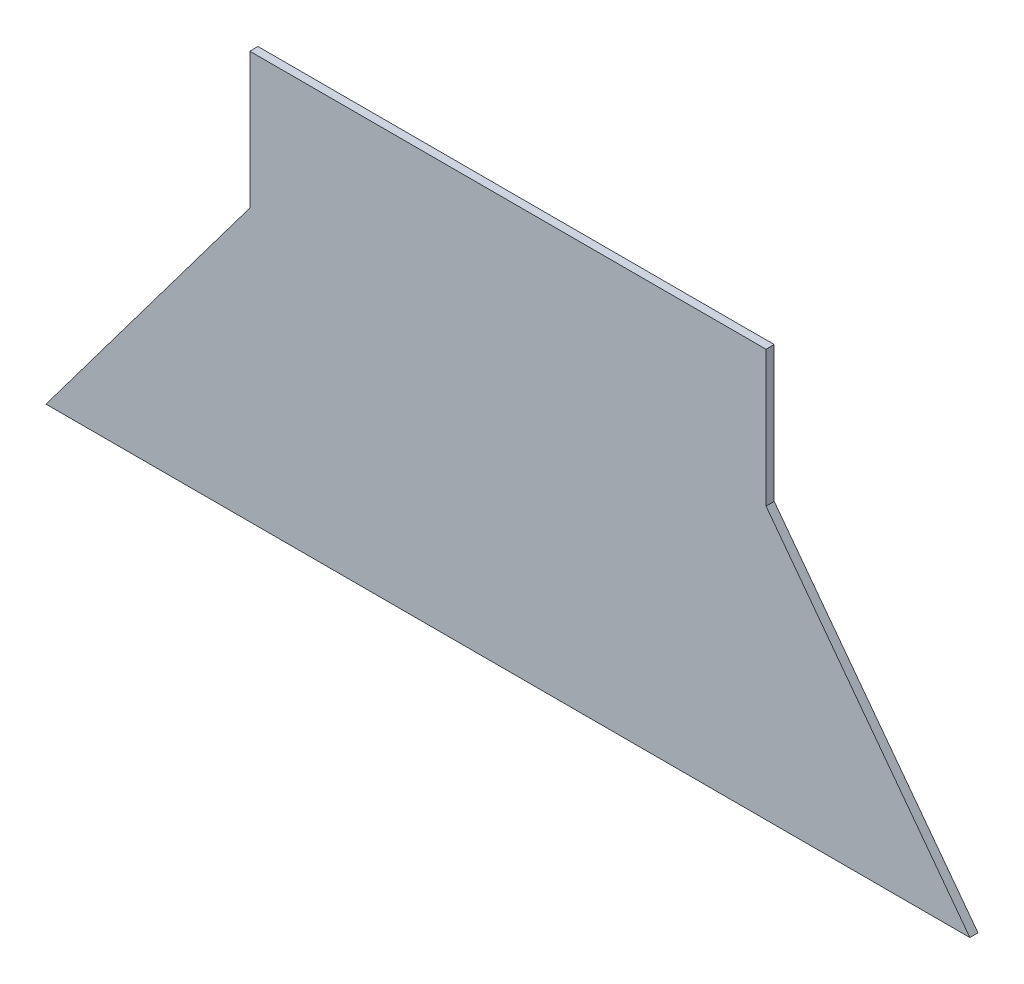
ISO-10303-21;
HEADER;
FILE_DESCRIPTION(('STEP AP214'),'2;1');
FILE_NAME('part.step','',(''),(''),'','','');
FILE_SCHEMA(('AUTOMOTIVE_DESIGN { 1 0 10303 214 1 1 1 1 }'));
ENDSEC;
DATA;
#1=APPLICATION_CONTEXT('core data for automotive mechanical design processes');
#2=APPLICATION_PROTOCOL_DEFINITION('international standard','automotive_design',2000,#1);
#3=PRODUCT_CONTEXT('',#1,'mechanical');
#4=PRODUCT('Part','Part','',(#3));
#5=PRODUCT_RELATED_PRODUCT_CATEGORY('part','',(#4));
#6=PRODUCT_DEFINITION_FORMATION('','',#4);
#7=PRODUCT_DEFINITION_CONTEXT('part definition',#1,'design');
#8=PRODUCT_DEFINITION('design','',#6,#7);
#9=PRODUCT_DEFINITION_SHAPE('','',#8);
#10=(LENGTH_UNIT() NAMED_UNIT(*) SI_UNIT(.MILLI.,.METRE.));
#11=(NAMED_UNIT(*) PLANE_ANGLE_UNIT() SI_UNIT($,.RADIAN.));
#12=(NAMED_UNIT(*) SI_UNIT($,.STERADIAN.) SOLID_ANGLE_UNIT());
#13=UNCERTAINTY_MEASURE_WITH_UNIT(LENGTH_MEASURE(1.E-05),#10,'distance_accuracy_value','');
#14=(GEOMETRIC_REPRESENTATION_CONTEXT(3) GLOBAL_UNCERTAINTY_ASSIGNED_CONTEXT((#13)) GLOBAL_UNIT_ASSIGNED_CONTEXT((#10,
#11,#12)) REPRESENTATION_CONTEXT('',''));
#15=CARTESIAN_POINT('',(0.,0.,0.));
#16=DIRECTION('',(0.,0.,1.));
#17=DIRECTION('',(1.,0.,0.));
#18=AXIS2_PLACEMENT_3D('',#15,#16,#17);
#19=CARTESIAN_POINT('',(680.,0.,6.));
#20=DIRECTION('',(0.,1.,0.));
#21=DIRECTION('',(0.,0.,1.));
#22=AXIS2_PLACEMENT_3D('',#19,#20,#21);
#23=PLANE('',#22);
#24=DIRECTION('',(1.,0.,0.));
#25=VECTOR('',#24,1.);
#26=CARTESIAN_POINT('',(680.,0.,0.));
#27=LINE('',#26,#25);
#28=CARTESIAN_POINT('',(0.,0.,0.));
#29=VERTEX_POINT('',#28);
#30=CARTESIAN_POINT('',(680.,0.,0.));
#31=VERTEX_POINT('',#30);
#32=EDGE_CURVE('E132',#29,#31,#27,.T.);
#33=ORIENTED_EDGE('',*,*,#32,.T.);
#34=DIRECTION('',(0.,0.,-1.));
#35=VECTOR('',#34,1.);
#36=CARTESIAN_POINT('',(680.,0.,6.));
#37=LINE('',#36,#35);
#38=CARTESIAN_POINT('',(680.,0.,6.));
#39=VERTEX_POINT('',#38);
#40=EDGE_CURVE('E11',#39,#31,#37,.T.);
#41=ORIENTED_EDGE('',*,*,#40,.F.);
#42=DIRECTION('',(1.,0.,0.));
#43=VECTOR('',#42,1.);
#44=CARTESIAN_POINT('',(680.,0.,6.));
#45=LINE('',#44,#43);
#46=CARTESIAN_POINT('',(0.,0.,6.));
#47=VERTEX_POINT('',#46);
#48=EDGE_CURVE('E148',#47,#39,#45,.T.);
#49=ORIENTED_EDGE('',*,*,#48,.F.);
#50=DIRECTION('',(0.,0.,-1.));
#51=VECTOR('',#50,1.);
#52=CARTESIAN_POINT('',(0.,0.,6.));
#53=LINE('',#52,#51);
#54=EDGE_CURVE('E128',#47,#29,#53,.T.);
#55=ORIENTED_EDGE('',*,*,#54,.T.);
#56=EDGE_LOOP('',(#33,#41,#49,#55));
#57=FACE_BOUND('',#56,.T.);
#58=ADVANCED_FACE('F43',(#57),#23,.F.);
#59=CARTESIAN_POINT('',(530.,200.,6.));
#60=DIRECTION('',(-0.8,-0.6,0.));
#61=DIRECTION('',(0.6,-0.8,0.));
#62=AXIS2_PLACEMENT_3D('',#59,#60,#61);
#63=PLANE('',#62);
#64=DIRECTION('',(-0.6,0.8,0.));
#65=VECTOR('',#64,1.);
#66=CARTESIAN_POINT('',(530.,200.,0.));
#67=LINE('',#66,#65);
#68=CARTESIAN_POINT('',(530.,200.,0.));
#69=VERTEX_POINT('',#68);
#70=EDGE_CURVE('E136',#31,#69,#67,.T.);
#71=ORIENTED_EDGE('',*,*,#70,.T.);
#72=DIRECTION('',(0.,0.,-1.));
#73=VECTOR('',#72,1.);
#74=CARTESIAN_POINT('',(530.,200.,6.));
#75=LINE('',#74,#73);
#76=CARTESIAN_POINT('',(530.,200.,6.));
#77=VERTEX_POINT('',#76);
#78=EDGE_CURVE('E52',#77,#69,#75,.T.);
#79=ORIENTED_EDGE('',*,*,#78,.F.);
#80=DIRECTION('',(-0.6,0.8,0.));
#81=VECTOR('',#80,1.);
#82=CARTESIAN_POINT('',(530.,200.,6.));
#83=LINE('',#82,#81);
#84=EDGE_CURVE('E97',#39,#77,#83,.T.);
#85=ORIENTED_EDGE('',*,*,#84,.F.);
#86=ORIENTED_EDGE('',*,*,#40,.T.);
#87=EDGE_LOOP('',(#71,#79,#85,#86));
#88=FACE_BOUND('',#87,.T.);
#89=ADVANCED_FACE('F176',(#88),#63,.F.);
#90=CARTESIAN_POINT('',(530.,300.,6.));
#91=DIRECTION('',(-1.,0.,0.));
#92=DIRECTION('',(0.,0.,1.));
#93=AXIS2_PLACEMENT_3D('',#90,#91,#92);
#94=PLANE('',#93);
#95=DIRECTION('',(0.,1.,0.));
#96=VECTOR('',#95,1.);
#97=CARTESIAN_POINT('',(530.,300.,0.));
#98=LINE('',#97,#96);
#99=CARTESIAN_POINT('',(530.,300.,0.));
#100=VERTEX_POINT('',#99);
#101=EDGE_CURVE('E139',#69,#100,#98,.T.);
#102=ORIENTED_EDGE('',*,*,#101,.T.);
#103=DIRECTION('',(0.,0.,-1.));
#104=VECTOR('',#103,1.);
#105=CARTESIAN_POINT('',(530.,300.,6.));
#106=LINE('',#105,#104);
#107=CARTESIAN_POINT('',(530.,300.,6.));
#108=VERTEX_POINT('',#107);
#109=EDGE_CURVE('E121',#108,#100,#106,.T.);
#110=ORIENTED_EDGE('',*,*,#109,.F.);
#111=DIRECTION('',(0.,1.,0.));
#112=VECTOR('',#111,1.);
#113=CARTESIAN_POINT('',(530.,300.,6.));
#114=LINE('',#113,#112);
#115=EDGE_CURVE('E110',#77,#108,#114,.T.);
#116=ORIENTED_EDGE('',*,*,#115,.F.);
#117=ORIENTED_EDGE('',*,*,#78,.T.);
#118=EDGE_LOOP('',(#102,#110,#116,#117));
#119=FACE_BOUND('',#118,.T.);
#120=ADVANCED_FACE('F158',(#119),#94,.F.);
#121=CARTESIAN_POINT('',(150.,300.,6.));
#122=DIRECTION('',(0.,-1.,0.));
#123=DIRECTION('',(1.,0.,0.));
#124=AXIS2_PLACEMENT_3D('',#121,#122,#123);
#125=PLANE('',#124);
#126=DIRECTION('',(-1.,0.,0.));
#127=VECTOR('',#126,1.);
#128=CARTESIAN_POINT('',(150.,300.,0.));
#129=LINE('',#128,#127);
#130=CARTESIAN_POINT('',(150.,300.,0.));
#131=VERTEX_POINT('',#130);
#132=EDGE_CURVE('E119',#100,#131,#129,.T.);
#133=ORIENTED_EDGE('',*,*,#132,.T.);
#134=DIRECTION('',(0.,0.,-1.));
#135=VECTOR('',#134,1.);
#136=CARTESIAN_POINT('',(150.,300.,6.));
#137=LINE('',#136,#135);
#138=CARTESIAN_POINT('',(150.,300.,6.));
#139=VERTEX_POINT('',#138);
#140=EDGE_CURVE('E116',#139,#131,#137,.T.);
#141=ORIENTED_EDGE('',*,*,#140,.F.);
#142=DIRECTION('',(-1.,0.,0.));
#143=VECTOR('',#142,1.);
#144=CARTESIAN_POINT('',(150.,300.,6.));
#145=LINE('',#144,#143);
#146=EDGE_CURVE('E104',#108,#139,#145,.T.);
#147=ORIENTED_EDGE('',*,*,#146,.F.);
#148=ORIENTED_EDGE('',*,*,#109,.T.);
#149=EDGE_LOOP('',(#133,#141,#147,#148));
#150=FACE_BOUND('',#149,.T.);
#151=ADVANCED_FACE('F117',(#150),#125,.F.);
#152=CARTESIAN_POINT('',(150.,200.,6.));
#153=DIRECTION('',(1.,0.,0.));
#154=DIRECTION('',(0.,0.,-1.));
#155=AXIS2_PLACEMENT_3D('',#152,#153,#154);
#156=PLANE('',#155);
#157=DIRECTION('',(0.,-1.,0.));
#158=VECTOR('',#157,1.);
#159=CARTESIAN_POINT('',(150.,200.,0.));
#160=LINE('',#159,#158);
#161=CARTESIAN_POINT('',(150.,200.,0.));
#162=VERTEX_POINT('',#161);
#163=EDGE_CURVE('E83',#131,#162,#160,.T.);
#164=ORIENTED_EDGE('',*,*,#163,.T.);
#165=DIRECTION('',(0.,0.,-1.));
#166=VECTOR('',#165,1.);
#167=CARTESIAN_POINT('',(150.,200.,6.));
#168=LINE('',#167,#166);
#169=CARTESIAN_POINT('',(150.,200.,6.));
#170=VERTEX_POINT('',#169);
#171=EDGE_CURVE('E122',#170,#162,#168,.T.);
#172=ORIENTED_EDGE('',*,*,#171,.F.);
#173=DIRECTION('',(0.,-1.,0.));
#174=VECTOR('',#173,1.);
#175=CARTESIAN_POINT('',(150.,200.,6.));
#176=LINE('',#175,#174);
#177=EDGE_CURVE('E108',#139,#170,#176,.T.);
#178=ORIENTED_EDGE('',*,*,#177,.F.);
#179=ORIENTED_EDGE('',*,*,#140,.T.);
#180=EDGE_LOOP('',(#164,#172,#178,#179));
#181=FACE_BOUND('',#180,.T.);
#182=ADVANCED_FACE('F124',(#181),#156,.F.);
#183=CARTESIAN_POINT('',(0.,0.,6.));
#184=DIRECTION('',(0.8,-0.6,0.));
#185=DIRECTION('',(0.6,0.8,0.));
#186=AXIS2_PLACEMENT_3D('',#183,#184,#185);
#187=PLANE('',#186);
#188=DIRECTION('',(-0.6,-0.8,0.));
#189=VECTOR('',#188,1.);
#190=CARTESIAN_POINT('',(0.,0.,0.));
#191=LINE('',#190,#189);
#192=EDGE_CURVE('E89',#162,#29,#191,.T.);
#193=ORIENTED_EDGE('',*,*,#192,.T.);
#194=ORIENTED_EDGE('',*,*,#54,.F.);
#195=DIRECTION('',(-0.6,-0.8,0.));
#196=VECTOR('',#195,1.);
#197=CARTESIAN_POINT('',(0.,0.,6.));
#198=LINE('',#197,#196);
#199=EDGE_CURVE('E60',#170,#47,#198,.T.);
#200=ORIENTED_EDGE('',*,*,#199,.F.);
#201=ORIENTED_EDGE('',*,*,#171,.T.);
#202=EDGE_LOOP('',(#193,#194,#200,#201));
#203=FACE_BOUND('',#202,.T.);
#204=ADVANCED_FACE('F165',(#203),#187,.F.);
#205=CARTESIAN_POINT('',(0.,0.,6.));
#206=DIRECTION('',(0.,0.,-1.));
#207=DIRECTION('',(-1.,0.,0.));
#208=AXIS2_PLACEMENT_3D('',#205,#206,#207);
#209=PLANE('',#208);
#210=ORIENTED_EDGE('',*,*,#48,.T.);
#211=ORIENTED_EDGE('',*,*,#84,.T.);
#212=ORIENTED_EDGE('',*,*,#115,.T.);
#213=ORIENTED_EDGE('',*,*,#146,.T.);
#214=ORIENTED_EDGE('',*,*,#177,.T.);
#215=ORIENTED_EDGE('',*,*,#199,.T.);
#216=EDGE_LOOP('',(#210,#211,#212,#213,#214,#215));
#217=FACE_BOUND('',#216,.T.);
#218=ADVANCED_FACE('F106',(#217),#209,.F.);
#219=CARTESIAN_POINT('',(0.,0.,0.));
#220=DIRECTION('',(0.,0.,-1.));
#221=DIRECTION('',(-1.,0.,0.));
#222=AXIS2_PLACEMENT_3D('',#219,#220,#221);
#223=PLANE('',#222);
#224=ORIENTED_EDGE('',*,*,#32,.F.);
#225=ORIENTED_EDGE('',*,*,#192,.F.);
#226=ORIENTED_EDGE('',*,*,#163,.F.);
#227=ORIENTED_EDGE('',*,*,#132,.F.);
#228=ORIENTED_EDGE('',*,*,#101,.F.);
#229=ORIENTED_EDGE('',*,*,#70,.F.);
#230=EDGE_LOOP('',(#224,#225,#226,#227,#228,#229));
#231=FACE_BOUND('',#230,.T.);
#232=ADVANCED_FACE('F161',(#231),#223,.T.);
#233=CLOSED_SHELL('',(#58,#89,#120,#151,#182,#204,#218,#232));
#234=MANIFOLD_SOLID_BREP('B2',#233);
#235=ADVANCED_BREP_SHAPE_REPRESENTATION('',(#18,#234),#14);
#236=SHAPE_DEFINITION_REPRESENTATION(#9,#235);
ENDSEC;
END-ISO-10303-21;
